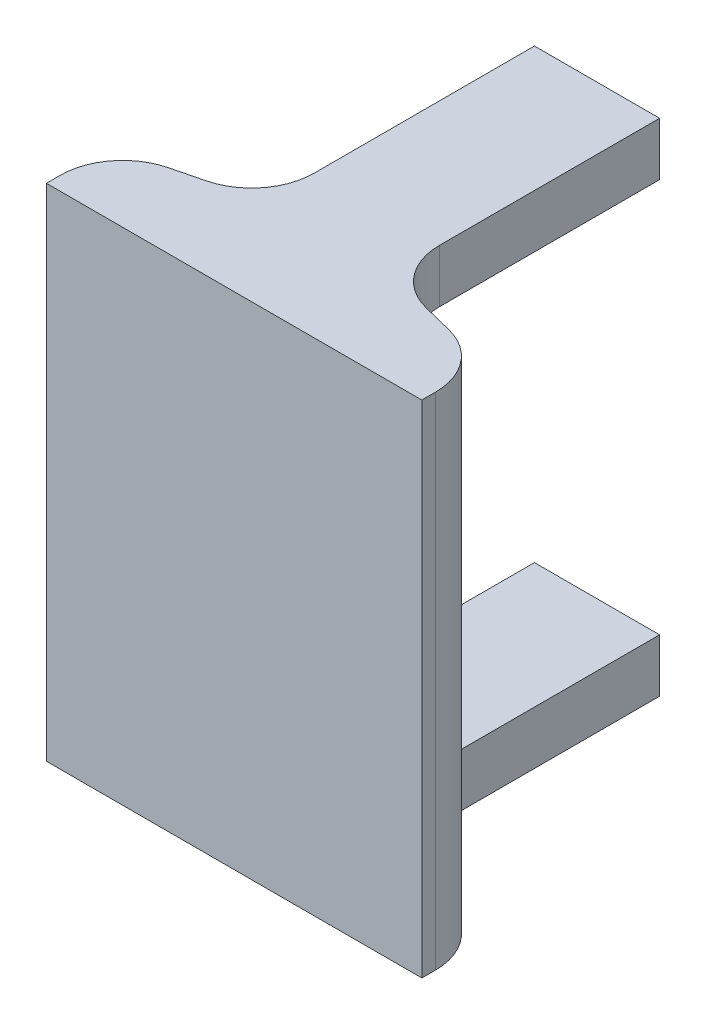
ISO-10303-21;
HEADER;
FILE_DESCRIPTION(('STEP AP214'),'2;1');
FILE_NAME('part.step','',(''),(''),'','','');
FILE_SCHEMA(('AUTOMOTIVE_DESIGN { 1 0 10303 214 1 1 1 1 }'));
ENDSEC;
DATA;
#1=APPLICATION_CONTEXT('core data for automotive mechanical design processes');
#2=APPLICATION_PROTOCOL_DEFINITION('international standard','automotive_design',2000,#1);
#3=PRODUCT_CONTEXT('',#1,'mechanical');
#4=PRODUCT('Part','Part','',(#3));
#5=PRODUCT_RELATED_PRODUCT_CATEGORY('part','',(#4));
#6=PRODUCT_DEFINITION_FORMATION('','',#4);
#7=PRODUCT_DEFINITION_CONTEXT('part definition',#1,'design');
#8=PRODUCT_DEFINITION('design','',#6,#7);
#9=PRODUCT_DEFINITION_SHAPE('','',#8);
#10=(LENGTH_UNIT() NAMED_UNIT(*) SI_UNIT(.MILLI.,.METRE.));
#11=(NAMED_UNIT(*) PLANE_ANGLE_UNIT() SI_UNIT($,.RADIAN.));
#12=(NAMED_UNIT(*) SI_UNIT($,.STERADIAN.) SOLID_ANGLE_UNIT());
#13=UNCERTAINTY_MEASURE_WITH_UNIT(LENGTH_MEASURE(1.E-05),#10,'distance_accuracy_value','');
#14=(GEOMETRIC_REPRESENTATION_CONTEXT(3) GLOBAL_UNCERTAINTY_ASSIGNED_CONTEXT((#13)) GLOBAL_UNIT_ASSIGNED_CONTEXT((#10,
#11,#12)) REPRESENTATION_CONTEXT('',''));
#15=CARTESIAN_POINT('',(0.,0.,0.));
#16=DIRECTION('',(0.,0.,1.));
#17=DIRECTION('',(1.,0.,0.));
#18=AXIS2_PLACEMENT_3D('',#15,#16,#17);
#19=CARTESIAN_POINT('',(0.,80.,-43.));
#20=DIRECTION('',(0.,0.,1.));
#21=DIRECTION('',(1.,0.,0.));
#22=AXIS2_PLACEMENT_3D('',#19,#20,#21);
#23=PLANE('',#22);
#24=DIRECTION('',(-1.,0.,0.));
#25=VECTOR('',#24,1.);
#26=CARTESIAN_POINT('',(182.003460166184,8.5,-43.));
#27=LINE('',#26,#25);
#28=CARTESIAN_POINT('',(10.,8.50000000000001,-43.));
#29=VERTEX_POINT('',#28);
#30=CARTESIAN_POINT('',(-10.,8.50000000000001,-43.));
#31=VERTEX_POINT('',#30);
#32=EDGE_CURVE('E185',#29,#31,#27,.T.);
#33=ORIENTED_EDGE('',*,*,#32,.F.);
#34=DIRECTION('',(0.,-1.,0.));
#35=VECTOR('',#34,1.);
#36=CARTESIAN_POINT('',(10.,80.,-43.));
#37=LINE('',#36,#35);
#38=CARTESIAN_POINT('',(10.,0.,-43.));
#39=VERTEX_POINT('',#38);
#40=EDGE_CURVE('E320',#29,#39,#37,.T.);
#41=ORIENTED_EDGE('',*,*,#40,.T.);
#42=DIRECTION('',(-1.,0.,0.));
#43=VECTOR('',#42,1.);
#44=CARTESIAN_POINT('',(0.,0.,-43.));
#45=LINE('',#44,#43);
#46=CARTESIAN_POINT('',(-10.,0.,-43.));
#47=VERTEX_POINT('',#46);
#48=EDGE_CURVE('E274',#39,#47,#45,.T.);
#49=ORIENTED_EDGE('',*,*,#48,.T.);
#50=DIRECTION('',(0.,-1.,0.));
#51=VECTOR('',#50,1.);
#52=CARTESIAN_POINT('',(-10.,80.,-43.));
#53=LINE('',#52,#51);
#54=EDGE_CURVE('E315',#31,#47,#53,.T.);
#55=ORIENTED_EDGE('',*,*,#54,.F.);
#56=EDGE_LOOP('',(#33,#41,#49,#55));
#57=FACE_BOUND('',#56,.T.);
#58=ADVANCED_FACE('F39',(#57),#23,.F.);
#59=CARTESIAN_POINT('',(20.,80.,-7.80776406404415));
#60=DIRECTION('',(0.,-1.,0.));
#61=DIRECTION('',(0.,0.,-1.));
#62=AXIS2_PLACEMENT_3D('',#59,#60,#61);
#63=CYLINDRICAL_SURFACE('',#62,10.);
#64=CARTESIAN_POINT('',(20.,71.5,-7.80776406404415));
#65=DIRECTION('',(0.,-1.,0.));
#66=DIRECTION('',(0.,0.,-1.));
#67=AXIS2_PLACEMENT_3D('',#64,#65,#66);
#68=CIRCLE('',#67,10.);
#69=CARTESIAN_POINT('',(10.,71.5,-7.80776406404421));
#70=VERTEX_POINT('',#69);
#71=CARTESIAN_POINT('',(11.231567716833,71.5,-3.));
#72=VERTEX_POINT('',#71);
#73=EDGE_CURVE('E214',#70,#72,#68,.F.);
#74=ORIENTED_EDGE('',*,*,#73,.F.);
#75=DIRECTION('',(0.,-1.,0.));
#76=VECTOR('',#75,1.);
#77=CARTESIAN_POINT('',(10.,80.,-7.80776406404421));
#78=LINE('',#77,#76);
#79=CARTESIAN_POINT('',(10.,80.,-7.80776406404421));
#80=VERTEX_POINT('',#79);
#81=EDGE_CURVE('E326',#80,#70,#78,.T.);
#82=ORIENTED_EDGE('',*,*,#81,.F.);
#83=CARTESIAN_POINT('',(20.,80.,-7.80776406404415));
#84=DIRECTION('',(0.,-1.,0.));
#85=DIRECTION('',(0.,0.,1.));
#86=AXIS2_PLACEMENT_3D('',#83,#84,#85);
#87=CIRCLE('',#86,10.);
#88=CARTESIAN_POINT('',(17.5746437496367,80.,1.89366093740918));
#89=VERTEX_POINT('',#88);
#90=EDGE_CURVE('E232',#89,#80,#87,.T.);
#91=ORIENTED_EDGE('',*,*,#90,.F.);
#92=DIRECTION('',(0.,-1.,0.));
#93=VECTOR('',#92,1.);
#94=CARTESIAN_POINT('',(17.5746437496367,80.,1.89366093740918));
#95=LINE('',#94,#93);
#96=CARTESIAN_POINT('',(17.5746437496367,0.,1.89366093740918));
#97=VERTEX_POINT('',#96);
#98=EDGE_CURVE('E330',#89,#97,#95,.T.);
#99=ORIENTED_EDGE('',*,*,#98,.T.);
#100=CARTESIAN_POINT('',(20.,0.,-7.80776406404415));
#101=DIRECTION('',(0.,-1.,0.));
#102=DIRECTION('',(0.,0.,1.));
#103=AXIS2_PLACEMENT_3D('',#100,#101,#102);
#104=CIRCLE('',#103,10.);
#105=CARTESIAN_POINT('',(10.,0.,-7.80776406404421));
#106=VERTEX_POINT('',#105);
#107=EDGE_CURVE('E266',#97,#106,#104,.T.);
#108=ORIENTED_EDGE('',*,*,#107,.T.);
#109=CARTESIAN_POINT('',(10.,8.50000000000001,-7.80776406404421));
#110=VERTEX_POINT('',#109);
#111=EDGE_CURVE('E325',#110,#106,#78,.T.);
#112=ORIENTED_EDGE('',*,*,#111,.F.);
#113=CARTESIAN_POINT('',(20.,8.50000000000001,-7.80776406404415));
#114=DIRECTION('',(0.,1.,0.));
#115=DIRECTION('',(0.,0.,1.));
#116=AXIS2_PLACEMENT_3D('',#113,#114,#115);
#117=CIRCLE('',#116,10.);
#118=CARTESIAN_POINT('',(11.231567716833,8.50000000000001,-3.));
#119=VERTEX_POINT('',#118);
#120=EDGE_CURVE('E60',#119,#110,#117,.F.);
#121=ORIENTED_EDGE('',*,*,#120,.F.);
#122=DIRECTION('',(0.,-1.,0.));
#123=VECTOR('',#122,1.);
#124=CARTESIAN_POINT('',(11.231567716833,80.,-3.));
#125=LINE('',#124,#123);
#126=EDGE_CURVE('E55',#72,#119,#125,.T.);
#127=ORIENTED_EDGE('',*,*,#126,.F.);
#128=EDGE_LOOP('',(#74,#82,#91,#99,#108,#112,#121,#127));
#129=FACE_BOUND('',#128,.T.);
#130=ADVANCED_FACE('F400',(#129),#63,.F.);
#131=CARTESIAN_POINT('',(10.,80.,-43.));
#132=DIRECTION('',(-1.,0.,0.));
#133=DIRECTION('',(0.,0.,1.));
#134=AXIS2_PLACEMENT_3D('',#131,#132,#133);
#135=PLANE('',#134);
#136=DIRECTION('',(0.,0.,1.));
#137=VECTOR('',#136,1.);
#138=CARTESIAN_POINT('',(10.,71.5,-43.));
#139=LINE('',#138,#137);
#140=CARTESIAN_POINT('',(10.,71.5,-43.));
#141=VERTEX_POINT('',#140);
#142=EDGE_CURVE('E210',#141,#70,#139,.T.);
#143=ORIENTED_EDGE('',*,*,#142,.F.);
#144=CARTESIAN_POINT('',(10.,80.,-43.));
#145=VERTEX_POINT('',#144);
#146=EDGE_CURVE('E321',#145,#141,#37,.T.);
#147=ORIENTED_EDGE('',*,*,#146,.F.);
#148=DIRECTION('',(0.,0.,-1.));
#149=VECTOR('',#148,1.);
#150=CARTESIAN_POINT('',(10.,80.,-43.));
#151=LINE('',#150,#149);
#152=EDGE_CURVE('E235',#80,#145,#151,.T.);
#153=ORIENTED_EDGE('',*,*,#152,.F.);
#154=ORIENTED_EDGE('',*,*,#81,.T.);
#155=EDGE_LOOP('',(#143,#147,#153,#154));
#156=FACE_BOUND('',#155,.T.);
#157=ADVANCED_FACE('F404',(#156),#135,.F.);
#158=DIRECTION('',(0.,0.,-1.));
#159=VECTOR('',#158,1.);
#160=CARTESIAN_POINT('',(10.,8.50000000000001,-43.));
#161=LINE('',#160,#159);
#162=EDGE_CURVE('E198',#110,#29,#161,.T.);
#163=ORIENTED_EDGE('',*,*,#162,.F.);
#164=ORIENTED_EDGE('',*,*,#111,.T.);
#165=DIRECTION('',(0.,0.,-1.));
#166=VECTOR('',#165,1.);
#167=CARTESIAN_POINT('',(10.,0.,-43.));
#168=LINE('',#167,#166);
#169=EDGE_CURVE('E270',#106,#39,#168,.T.);
#170=ORIENTED_EDGE('',*,*,#169,.T.);
#171=ORIENTED_EDGE('',*,*,#40,.F.);
#172=EDGE_LOOP('',(#163,#164,#170,#171));
#173=FACE_BOUND('',#172,.T.);
#174=ADVANCED_FACE('F399',(#173),#135,.F.);
#175=CARTESIAN_POINT('',(-10.,80.,-43.));
#176=DIRECTION('',(1.,0.,0.));
#177=DIRECTION('',(0.,0.,-1.));
#178=AXIS2_PLACEMENT_3D('',#175,#176,#177);
#179=PLANE('',#178);
#180=DIRECTION('',(0.,0.,-1.));
#181=VECTOR('',#180,1.);
#182=CARTESIAN_POINT('',(-10.,71.5,-43.));
#183=LINE('',#182,#181);
#184=CARTESIAN_POINT('',(-10.,71.5,-7.80776406404421));
#185=VERTEX_POINT('',#184);
#186=CARTESIAN_POINT('',(-10.,71.5,-43.));
#187=VERTEX_POINT('',#186);
#188=EDGE_CURVE('E206',#185,#187,#183,.T.);
#189=ORIENTED_EDGE('',*,*,#188,.F.);
#190=DIRECTION('',(0.,-1.,0.));
#191=VECTOR('',#190,1.);
#192=CARTESIAN_POINT('',(-10.,80.,-7.80776406404421));
#193=LINE('',#192,#191);
#194=CARTESIAN_POINT('',(-10.,80.,-7.80776406404421));
#195=VERTEX_POINT('',#194);
#196=EDGE_CURVE('E312',#195,#185,#193,.T.);
#197=ORIENTED_EDGE('',*,*,#196,.F.);
#198=DIRECTION('',(0.,0.,1.));
#199=VECTOR('',#198,1.);
#200=CARTESIAN_POINT('',(-10.,80.,-43.));
#201=LINE('',#200,#199);
#202=CARTESIAN_POINT('',(-10.,80.,-43.));
#203=VERTEX_POINT('',#202);
#204=EDGE_CURVE('E241',#203,#195,#201,.T.);
#205=ORIENTED_EDGE('',*,*,#204,.F.);
#206=EDGE_CURVE('E316',#203,#187,#53,.T.);
#207=ORIENTED_EDGE('',*,*,#206,.T.);
#208=EDGE_LOOP('',(#189,#197,#205,#207));
#209=FACE_BOUND('',#208,.T.);
#210=ADVANCED_FACE('F413',(#209),#179,.F.);
#211=DIRECTION('',(0.,0.,1.));
#212=VECTOR('',#211,1.);
#213=CARTESIAN_POINT('',(-10.,8.50000000000001,-43.));
#214=LINE('',#213,#212);
#215=CARTESIAN_POINT('',(-10.,8.50000000000001,-7.80776406404421));
#216=VERTEX_POINT('',#215);
#217=EDGE_CURVE('E179',#31,#216,#214,.T.);
#218=ORIENTED_EDGE('',*,*,#217,.F.);
#219=ORIENTED_EDGE('',*,*,#54,.T.);
#220=DIRECTION('',(0.,0.,1.));
#221=VECTOR('',#220,1.);
#222=CARTESIAN_POINT('',(-10.,0.,-43.));
#223=LINE('',#222,#221);
#224=CARTESIAN_POINT('',(-10.,0.,-7.80776406404421));
#225=VERTEX_POINT('',#224);
#226=EDGE_CURVE('E278',#47,#225,#223,.T.);
#227=ORIENTED_EDGE('',*,*,#226,.T.);
#228=EDGE_CURVE('E311',#216,#225,#193,.T.);
#229=ORIENTED_EDGE('',*,*,#228,.F.);
#230=EDGE_LOOP('',(#218,#219,#227,#229));
#231=FACE_BOUND('',#230,.T.);
#232=ADVANCED_FACE('F390',(#231),#179,.F.);
#233=CARTESIAN_POINT('',(-20.,80.,-7.80776406404415));
#234=DIRECTION('',(0.,-1.,0.));
#235=DIRECTION('',(0.,0.,-1.));
#236=AXIS2_PLACEMENT_3D('',#233,#234,#235);
#237=CYLINDRICAL_SURFACE('',#236,10.);
#238=CARTESIAN_POINT('',(-20.,71.5,-7.80776406404415));
#239=DIRECTION('',(0.,-1.,0.));
#240=DIRECTION('',(0.,0.,-1.));
#241=AXIS2_PLACEMENT_3D('',#238,#239,#240);
#242=CIRCLE('',#241,10.);
#243=CARTESIAN_POINT('',(-11.231567716833,71.5,-3.));
#244=VERTEX_POINT('',#243);
#245=EDGE_CURVE('E11',#244,#185,#242,.F.);
#246=ORIENTED_EDGE('',*,*,#245,.F.);
#247=DIRECTION('',(0.,-1.,0.));
#248=VECTOR('',#247,1.);
#249=CARTESIAN_POINT('',(-11.231567716833,80.,-3.));
#250=LINE('',#249,#248);
#251=CARTESIAN_POINT('',(-11.231567716833,8.50000000000001,-3.));
#252=VERTEX_POINT('',#251);
#253=EDGE_CURVE('E48',#252,#244,#250,.F.);
#254=ORIENTED_EDGE('',*,*,#253,.F.);
#255=CARTESIAN_POINT('',(-20.,8.50000000000001,-7.80776406404415));
#256=DIRECTION('',(0.,1.,0.));
#257=DIRECTION('',(0.,0.,1.));
#258=AXIS2_PLACEMENT_3D('',#255,#256,#257);
#259=CIRCLE('',#258,10.);
#260=EDGE_CURVE('E165',#216,#252,#259,.F.);
#261=ORIENTED_EDGE('',*,*,#260,.F.);
#262=ORIENTED_EDGE('',*,*,#228,.T.);
#263=CARTESIAN_POINT('',(-20.,0.,-7.80776406404415));
#264=DIRECTION('',(0.,-1.,0.));
#265=DIRECTION('',(0.,0.,-1.));
#266=AXIS2_PLACEMENT_3D('',#263,#264,#265);
#267=CIRCLE('',#266,10.);
#268=CARTESIAN_POINT('',(-17.5746437496367,0.,1.89366093740918));
#269=VERTEX_POINT('',#268);
#270=EDGE_CURVE('E282',#225,#269,#267,.T.);
#271=ORIENTED_EDGE('',*,*,#270,.T.);
#272=DIRECTION('',(0.,-1.,0.));
#273=VECTOR('',#272,1.);
#274=CARTESIAN_POINT('',(-17.5746437496367,80.,1.89366093740918));
#275=LINE('',#274,#273);
#276=CARTESIAN_POINT('',(-17.5746437496367,80.,1.89366093740918));
#277=VERTEX_POINT('',#276);
#278=EDGE_CURVE('E307',#277,#269,#275,.T.);
#279=ORIENTED_EDGE('',*,*,#278,.F.);
#280=CARTESIAN_POINT('',(-20.,80.,-7.80776406404415));
#281=DIRECTION('',(0.,-1.,0.));
#282=DIRECTION('',(0.,0.,-1.));
#283=AXIS2_PLACEMENT_3D('',#280,#281,#282);
#284=CIRCLE('',#283,10.);
#285=EDGE_CURVE('E244',#195,#277,#284,.T.);
#286=ORIENTED_EDGE('',*,*,#285,.F.);
#287=ORIENTED_EDGE('',*,*,#196,.T.);
#288=EDGE_LOOP('',(#246,#254,#261,#262,#271,#279,#286,#287));
#289=FACE_BOUND('',#288,.T.);
#290=ADVANCED_FACE('F164',(#289),#237,.F.);
#291=CARTESIAN_POINT('',(30.,80.,15.));
#292=DIRECTION('',(-1.,0.,0.));
#293=DIRECTION('',(0.,0.,1.));
#294=AXIS2_PLACEMENT_3D('',#291,#292,#293);
#295=PLANE('',#294);
#296=DIRECTION('',(0.,0.,-1.));
#297=VECTOR('',#296,1.);
#298=CARTESIAN_POINT('',(30.,0.,15.));
#299=LINE('',#298,#297);
#300=CARTESIAN_POINT('',(30.,0.,15.));
#301=VERTEX_POINT('',#300);
#302=CARTESIAN_POINT('',(30.,0.,12.8077640640442));
#303=VERTEX_POINT('',#302);
#304=EDGE_CURVE('E217',#301,#303,#299,.T.);
#305=ORIENTED_EDGE('',*,*,#304,.T.);
#306=DIRECTION('',(0.,-1.,0.));
#307=VECTOR('',#306,1.);
#308=CARTESIAN_POINT('',(30.,80.,12.8077640640442));
#309=LINE('',#308,#307);
#310=CARTESIAN_POINT('',(30.,80.,12.8077640640442));
#311=VERTEX_POINT('',#310);
#312=EDGE_CURVE('E338',#311,#303,#309,.T.);
#313=ORIENTED_EDGE('',*,*,#312,.F.);
#314=DIRECTION('',(0.,0.,-1.));
#315=VECTOR('',#314,1.);
#316=CARTESIAN_POINT('',(30.,80.,15.));
#317=LINE('',#316,#315);
#318=CARTESIAN_POINT('',(30.,80.,15.));
#319=VERTEX_POINT('',#318);
#320=EDGE_CURVE('E222',#319,#311,#317,.T.);
#321=ORIENTED_EDGE('',*,*,#320,.F.);
#322=DIRECTION('',(0.,-1.,0.));
#323=VECTOR('',#322,1.);
#324=CARTESIAN_POINT('',(30.,80.,15.));
#325=LINE('',#324,#323);
#326=EDGE_CURVE('E181',#319,#301,#325,.T.);
#327=ORIENTED_EDGE('',*,*,#326,.T.);
#328=EDGE_LOOP('',(#305,#313,#321,#327));
#329=FACE_BOUND('',#328,.T.);
#330=ADVANCED_FACE('F41',(#329),#295,.F.);
#331=CARTESIAN_POINT('',(20.,80.,12.8077640640442));
#332=DIRECTION('',(0.,-1.,0.));
#333=DIRECTION('',(0.,0.,-1.));
#334=AXIS2_PLACEMENT_3D('',#331,#332,#333);
#335=CYLINDRICAL_SURFACE('',#334,10.);
#336=CARTESIAN_POINT('',(20.,0.,12.8077640640442));
#337=DIRECTION('',(0.,1.,0.));
#338=DIRECTION('',(0.,0.,1.));
#339=AXIS2_PLACEMENT_3D('',#336,#337,#338);
#340=CIRCLE('',#339,10.);
#341=CARTESIAN_POINT('',(22.4253562503633,0.,3.10633906259082));
#342=VERTEX_POINT('',#341);
#343=EDGE_CURVE('E260',#303,#342,#340,.T.);
#344=ORIENTED_EDGE('',*,*,#343,.T.);
#345=DIRECTION('',(0.,-1.,0.));
#346=VECTOR('',#345,1.);
#347=CARTESIAN_POINT('',(22.4253562503633,80.,3.10633906259082));
#348=LINE('',#347,#346);
#349=CARTESIAN_POINT('',(22.4253562503633,80.,3.10633906259082));
#350=VERTEX_POINT('',#349);
#351=EDGE_CURVE('E334',#350,#342,#348,.T.);
#352=ORIENTED_EDGE('',*,*,#351,.F.);
#353=CARTESIAN_POINT('',(20.,80.,12.8077640640442));
#354=DIRECTION('',(0.,1.,0.));
#355=DIRECTION('',(0.,0.,1.));
#356=AXIS2_PLACEMENT_3D('',#353,#354,#355);
#357=CIRCLE('',#356,10.);
#358=EDGE_CURVE('E226',#311,#350,#357,.T.);
#359=ORIENTED_EDGE('',*,*,#358,.F.);
#360=ORIENTED_EDGE('',*,*,#312,.T.);
#361=EDGE_LOOP('',(#344,#352,#359,#360));
#362=FACE_BOUND('',#361,.T.);
#363=ADVANCED_FACE('F360',(#362),#335,.T.);
#364=CARTESIAN_POINT('',(22.4253562503633,80.,3.10633906259082));
#365=DIRECTION('',(-0.242535625036333,0.,0.970142500145332));
#366=DIRECTION('',(0.970142500145332,0.,0.242535625036333));
#367=AXIS2_PLACEMENT_3D('',#364,#365,#366);
#368=PLANE('',#367);
#369=DIRECTION('',(-0.970142500145332,0.,-0.242535625036333));
#370=VECTOR('',#369,1.);
#371=CARTESIAN_POINT('',(22.4253562503633,0.,3.10633906259082));
#372=LINE('',#371,#370);
#373=EDGE_CURVE('E263',#342,#97,#372,.T.);
#374=ORIENTED_EDGE('',*,*,#373,.T.);
#375=ORIENTED_EDGE('',*,*,#98,.F.);
#376=DIRECTION('',(-0.970142500145332,0.,-0.242535625036333));
#377=VECTOR('',#376,1.);
#378=CARTESIAN_POINT('',(22.4253562503633,80.,3.10633906259082));
#379=LINE('',#378,#377);
#380=EDGE_CURVE('E229',#350,#89,#379,.T.);
#381=ORIENTED_EDGE('',*,*,#380,.F.);
#382=ORIENTED_EDGE('',*,*,#351,.T.);
#383=EDGE_LOOP('',(#374,#375,#381,#382));
#384=FACE_BOUND('',#383,.T.);
#385=ADVANCED_FACE('F364',(#384),#368,.F.);
#386=ORIENTED_EDGE('',*,*,#146,.T.);
#387=DIRECTION('',(-1.,0.,0.));
#388=VECTOR('',#387,1.);
#389=CARTESIAN_POINT('',(182.003460166184,71.5,-43.));
#390=LINE('',#389,#388);
#391=EDGE_CURVE('E191',#141,#187,#390,.T.);
#392=ORIENTED_EDGE('',*,*,#391,.T.);
#393=ORIENTED_EDGE('',*,*,#206,.F.);
#394=DIRECTION('',(-1.,0.,0.));
#395=VECTOR('',#394,1.);
#396=CARTESIAN_POINT('',(0.,80.,-43.));
#397=LINE('',#396,#395);
#398=EDGE_CURVE('E238',#145,#203,#397,.T.);
#399=ORIENTED_EDGE('',*,*,#398,.F.);
#400=EDGE_LOOP('',(#386,#392,#393,#399));
#401=FACE_BOUND('',#400,.T.);
#402=ADVANCED_FACE('F410',(#401),#23,.F.);
#403=CARTESIAN_POINT('',(-22.4253562503633,80.,3.10633906259082));
#404=DIRECTION('',(0.242535625036333,0.,0.970142500145332));
#405=DIRECTION('',(0.970142500145332,0.,-0.242535625036333));
#406=AXIS2_PLACEMENT_3D('',#403,#404,#405);
#407=PLANE('',#406);
#408=DIRECTION('',(-0.970142500145332,0.,0.242535625036333));
#409=VECTOR('',#408,1.);
#410=CARTESIAN_POINT('',(-22.4253562503633,0.,3.10633906259082));
#411=LINE('',#410,#409);
#412=CARTESIAN_POINT('',(-22.4253562503633,0.,3.10633906259082));
#413=VERTEX_POINT('',#412);
#414=EDGE_CURVE('E285',#269,#413,#411,.T.);
#415=ORIENTED_EDGE('',*,*,#414,.T.);
#416=DIRECTION('',(0.,-1.,0.));
#417=VECTOR('',#416,1.);
#418=CARTESIAN_POINT('',(-22.4253562503633,80.,3.10633906259082));
#419=LINE('',#418,#417);
#420=CARTESIAN_POINT('',(-22.4253562503633,80.,3.10633906259082));
#421=VERTEX_POINT('',#420);
#422=EDGE_CURVE('E303',#421,#413,#419,.T.);
#423=ORIENTED_EDGE('',*,*,#422,.F.);
#424=DIRECTION('',(-0.970142500145332,0.,0.242535625036333));
#425=VECTOR('',#424,1.);
#426=CARTESIAN_POINT('',(-22.4253562503633,80.,3.10633906259082));
#427=LINE('',#426,#425);
#428=EDGE_CURVE('E247',#277,#421,#427,.T.);
#429=ORIENTED_EDGE('',*,*,#428,.F.);
#430=ORIENTED_EDGE('',*,*,#278,.T.);
#431=EDGE_LOOP('',(#415,#423,#429,#430));
#432=FACE_BOUND('',#431,.T.);
#433=ADVANCED_FACE('F383',(#432),#407,.F.);
#434=CARTESIAN_POINT('',(-20.,80.,12.8077640640442));
#435=DIRECTION('',(0.,-1.,0.));
#436=DIRECTION('',(0.,0.,-1.));
#437=AXIS2_PLACEMENT_3D('',#434,#435,#436);
#438=CYLINDRICAL_SURFACE('',#437,10.);
#439=CARTESIAN_POINT('',(-20.,0.,12.8077640640442));
#440=DIRECTION('',(0.,1.,0.));
#441=DIRECTION('',(0.,0.,-1.));
#442=AXIS2_PLACEMENT_3D('',#439,#440,#441);
#443=CIRCLE('',#442,10.);
#444=CARTESIAN_POINT('',(-30.,0.,12.8077640640442));
#445=VERTEX_POINT('',#444);
#446=EDGE_CURVE('E288',#413,#445,#443,.T.);
#447=ORIENTED_EDGE('',*,*,#446,.T.);
#448=DIRECTION('',(0.,-1.,0.));
#449=VECTOR('',#448,1.);
#450=CARTESIAN_POINT('',(-30.,80.,12.8077640640442));
#451=LINE('',#450,#449);
#452=CARTESIAN_POINT('',(-30.,80.,12.8077640640442));
#453=VERTEX_POINT('',#452);
#454=EDGE_CURVE('E299',#453,#445,#451,.T.);
#455=ORIENTED_EDGE('',*,*,#454,.F.);
#456=CARTESIAN_POINT('',(-20.,80.,12.8077640640442));
#457=DIRECTION('',(0.,1.,0.));
#458=DIRECTION('',(0.,0.,-1.));
#459=AXIS2_PLACEMENT_3D('',#456,#457,#458);
#460=CIRCLE('',#459,10.);
#461=EDGE_CURVE('E250',#421,#453,#460,.T.);
#462=ORIENTED_EDGE('',*,*,#461,.F.);
#463=ORIENTED_EDGE('',*,*,#422,.T.);
#464=EDGE_LOOP('',(#447,#455,#462,#463));
#465=FACE_BOUND('',#464,.T.);
#466=ADVANCED_FACE('F379',(#465),#438,.T.);
#467=CARTESIAN_POINT('',(-30.,80.,15.));
#468=DIRECTION('',(1.,0.,0.));
#469=DIRECTION('',(0.,0.,-1.));
#470=AXIS2_PLACEMENT_3D('',#467,#468,#469);
#471=PLANE('',#470);
#472=DIRECTION('',(0.,0.,1.));
#473=VECTOR('',#472,1.);
#474=CARTESIAN_POINT('',(-30.,0.,15.));
#475=LINE('',#474,#473);
#476=CARTESIAN_POINT('',(-30.,0.,15.));
#477=VERTEX_POINT('',#476);
#478=EDGE_CURVE('E291',#445,#477,#475,.T.);
#479=ORIENTED_EDGE('',*,*,#478,.T.);
#480=DIRECTION('',(0.,-1.,0.));
#481=VECTOR('',#480,1.);
#482=CARTESIAN_POINT('',(-30.,80.,15.));
#483=LINE('',#482,#481);
#484=CARTESIAN_POINT('',(-30.,80.,15.));
#485=VERTEX_POINT('',#484);
#486=EDGE_CURVE('E257',#485,#477,#483,.T.);
#487=ORIENTED_EDGE('',*,*,#486,.F.);
#488=DIRECTION('',(0.,0.,1.));
#489=VECTOR('',#488,1.);
#490=CARTESIAN_POINT('',(-30.,80.,15.));
#491=LINE('',#490,#489);
#492=EDGE_CURVE('E253',#453,#485,#491,.T.);
#493=ORIENTED_EDGE('',*,*,#492,.F.);
#494=ORIENTED_EDGE('',*,*,#454,.T.);
#495=EDGE_LOOP('',(#479,#487,#493,#494));
#496=FACE_BOUND('',#495,.T.);
#497=ADVANCED_FACE('F374',(#496),#471,.F.);
#498=CARTESIAN_POINT('',(0.,80.,15.));
#499=DIRECTION('',(0.,0.,-1.));
#500=DIRECTION('',(-1.,0.,0.));
#501=AXIS2_PLACEMENT_3D('',#498,#499,#500);
#502=PLANE('',#501);
#503=DIRECTION('',(1.,0.,0.));
#504=VECTOR('',#503,1.);
#505=CARTESIAN_POINT('',(0.,0.,15.));
#506=LINE('',#505,#504);
#507=EDGE_CURVE('E223',#477,#301,#506,.T.);
#508=ORIENTED_EDGE('',*,*,#507,.T.);
#509=ORIENTED_EDGE('',*,*,#326,.F.);
#510=DIRECTION('',(1.,0.,0.));
#511=VECTOR('',#510,1.);
#512=CARTESIAN_POINT('',(0.,80.,15.));
#513=LINE('',#512,#511);
#514=EDGE_CURVE('E218',#485,#319,#513,.T.);
#515=ORIENTED_EDGE('',*,*,#514,.F.);
#516=ORIENTED_EDGE('',*,*,#486,.T.);
#517=EDGE_LOOP('',(#508,#509,#515,#516));
#518=FACE_BOUND('',#517,.T.);
#519=ADVANCED_FACE('F349',(#518),#502,.F.);
#520=CARTESIAN_POINT('',(20.,80.,12.8077640640442));
#521=DIRECTION('',(0.,1.,0.));
#522=DIRECTION('',(0.,0.,1.));
#523=AXIS2_PLACEMENT_3D('',#520,#521,#522);
#524=PLANE('',#523);
#525=ORIENTED_EDGE('',*,*,#514,.T.);
#526=ORIENTED_EDGE('',*,*,#320,.T.);
#527=ORIENTED_EDGE('',*,*,#358,.T.);
#528=ORIENTED_EDGE('',*,*,#380,.T.);
#529=ORIENTED_EDGE('',*,*,#90,.T.);
#530=ORIENTED_EDGE('',*,*,#152,.T.);
#531=ORIENTED_EDGE('',*,*,#398,.T.);
#532=ORIENTED_EDGE('',*,*,#204,.T.);
#533=ORIENTED_EDGE('',*,*,#285,.T.);
#534=ORIENTED_EDGE('',*,*,#428,.T.);
#535=ORIENTED_EDGE('',*,*,#461,.T.);
#536=ORIENTED_EDGE('',*,*,#492,.T.);
#537=EDGE_LOOP('',(#525,#526,#527,#528,#529,#530,#531,#532,#533,#534,#535,#536));
#538=FACE_BOUND('',#537,.T.);
#539=ADVANCED_FACE('F368',(#538),#524,.T.);
#540=CARTESIAN_POINT('',(20.,0.,12.8077640640442));
#541=DIRECTION('',(0.,1.,0.));
#542=DIRECTION('',(0.,0.,1.));
#543=AXIS2_PLACEMENT_3D('',#540,#541,#542);
#544=PLANE('',#543);
#545=ORIENTED_EDGE('',*,*,#304,.F.);
#546=ORIENTED_EDGE('',*,*,#507,.F.);
#547=ORIENTED_EDGE('',*,*,#478,.F.);
#548=ORIENTED_EDGE('',*,*,#446,.F.);
#549=ORIENTED_EDGE('',*,*,#414,.F.);
#550=ORIENTED_EDGE('',*,*,#270,.F.);
#551=ORIENTED_EDGE('',*,*,#226,.F.);
#552=ORIENTED_EDGE('',*,*,#48,.F.);
#553=ORIENTED_EDGE('',*,*,#169,.F.);
#554=ORIENTED_EDGE('',*,*,#107,.F.);
#555=ORIENTED_EDGE('',*,*,#373,.F.);
#556=ORIENTED_EDGE('',*,*,#343,.F.);
#557=EDGE_LOOP('',(#545,#546,#547,#548,#549,#550,#551,#552,#553,#554,#555,#556));
#558=FACE_BOUND('',#557,.T.);
#559=ADVANCED_FACE('F355',(#558),#544,.F.);
#560=CARTESIAN_POINT('',(182.003460166184,71.5,-3.));
#561=DIRECTION('',(0.,-1.,0.));
#562=DIRECTION('',(0.,0.,-1.));
#563=AXIS2_PLACEMENT_3D('',#560,#561,#562);
#564=PLANE('',#563);
#565=ORIENTED_EDGE('',*,*,#142,.T.);
#566=ORIENTED_EDGE('',*,*,#73,.T.);
#567=DIRECTION('',(-1.,0.,0.));
#568=VECTOR('',#567,1.);
#569=CARTESIAN_POINT('',(182.003460166184,71.5,-3.));
#570=LINE('',#569,#568);
#571=EDGE_CURVE('E188',#72,#244,#570,.T.);
#572=ORIENTED_EDGE('',*,*,#571,.T.);
#573=ORIENTED_EDGE('',*,*,#245,.T.);
#574=ORIENTED_EDGE('',*,*,#188,.T.);
#575=ORIENTED_EDGE('',*,*,#391,.F.);
#576=EDGE_LOOP('',(#565,#566,#572,#573,#574,#575));
#577=FACE_BOUND('',#576,.T.);
#578=ADVANCED_FACE('F415',(#577),#564,.T.);
#579=CARTESIAN_POINT('',(182.003460166184,71.5,-3.));
#580=DIRECTION('',(0.,0.,-1.));
#581=DIRECTION('',(-1.,0.,0.));
#582=AXIS2_PLACEMENT_3D('',#579,#580,#581);
#583=PLANE('',#582);
#584=ORIENTED_EDGE('',*,*,#571,.F.);
#585=ORIENTED_EDGE('',*,*,#126,.T.);
#586=DIRECTION('',(-1.,0.,0.));
#587=VECTOR('',#586,1.);
#588=CARTESIAN_POINT('',(182.003460166184,8.5,-3.));
#589=LINE('',#588,#587);
#590=EDGE_CURVE('E177',#119,#252,#589,.T.);
#591=ORIENTED_EDGE('',*,*,#590,.T.);
#592=ORIENTED_EDGE('',*,*,#253,.T.);
#593=EDGE_LOOP('',(#584,#585,#591,#592));
#594=FACE_BOUND('',#593,.T.);
#595=ADVANCED_FACE('F183',(#594),#583,.T.);
#596=CARTESIAN_POINT('',(182.003460166184,8.5,-3.));
#597=DIRECTION('',(0.,1.,0.));
#598=DIRECTION('',(0.,0.,1.));
#599=AXIS2_PLACEMENT_3D('',#596,#597,#598);
#600=PLANE('',#599);
#601=ORIENTED_EDGE('',*,*,#590,.F.);
#602=ORIENTED_EDGE('',*,*,#120,.T.);
#603=ORIENTED_EDGE('',*,*,#162,.T.);
#604=ORIENTED_EDGE('',*,*,#32,.T.);
#605=ORIENTED_EDGE('',*,*,#217,.T.);
#606=ORIENTED_EDGE('',*,*,#260,.T.);
#607=EDGE_LOOP('',(#601,#602,#603,#604,#605,#606));
#608=FACE_BOUND('',#607,.T.);
#609=ADVANCED_FACE('F176',(#608),#600,.T.);
#610=CLOSED_SHELL('',(#58,#130,#157,#174,#210,#232,#290,#330,#363,#385,#402,#433,#466,#497,#519,
#539,#559,#578,#595,#609));
#611=MANIFOLD_SOLID_BREP('B2',#610);
#612=ADVANCED_BREP_SHAPE_REPRESENTATION('',(#18,#611),#14);
#613=SHAPE_DEFINITION_REPRESENTATION(#9,#612);
ENDSEC;
END-ISO-10303-21;
